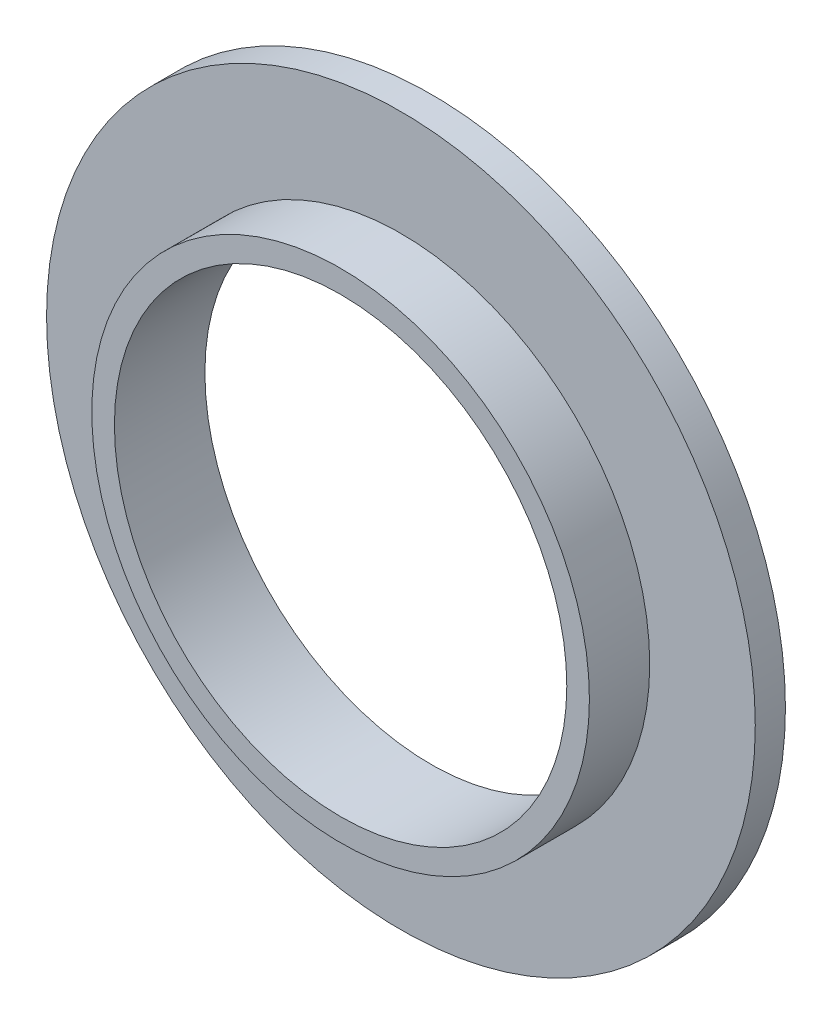
ISO-10303-21;
HEADER;
FILE_DESCRIPTION(('STEP AP214'),'2;1');
FILE_NAME('part.step','',(''),(''),'','','');
FILE_SCHEMA(('AUTOMOTIVE_DESIGN { 1 0 10303 214 1 1 1 1 }'));
ENDSEC;
DATA;
#1=APPLICATION_CONTEXT('core data for automotive mechanical design processes');
#2=APPLICATION_PROTOCOL_DEFINITION('international standard','automotive_design',2000,#1);
#3=PRODUCT_CONTEXT('',#1,'mechanical');
#4=PRODUCT('Part','Part','',(#3));
#5=PRODUCT_RELATED_PRODUCT_CATEGORY('part','',(#4));
#6=PRODUCT_DEFINITION_FORMATION('','',#4);
#7=PRODUCT_DEFINITION_CONTEXT('part definition',#1,'design');
#8=PRODUCT_DEFINITION('design','',#6,#7);
#9=PRODUCT_DEFINITION_SHAPE('','',#8);
#10=(LENGTH_UNIT() NAMED_UNIT(*) SI_UNIT(.MILLI.,.METRE.));
#11=(NAMED_UNIT(*) PLANE_ANGLE_UNIT() SI_UNIT($,.RADIAN.));
#12=(NAMED_UNIT(*) SI_UNIT($,.STERADIAN.) SOLID_ANGLE_UNIT());
#13=UNCERTAINTY_MEASURE_WITH_UNIT(LENGTH_MEASURE(1.E-05),#10,'distance_accuracy_value','');
#14=(GEOMETRIC_REPRESENTATION_CONTEXT(3) GLOBAL_UNCERTAINTY_ASSIGNED_CONTEXT((#13)) GLOBAL_UNIT_ASSIGNED_CONTEXT((#10,
#11,#12)) REPRESENTATION_CONTEXT('',''));
#15=CARTESIAN_POINT('',(0.,0.,0.));
#16=DIRECTION('',(0.,0.,1.));
#17=DIRECTION('',(1.,0.,0.));
#18=AXIS2_PLACEMENT_3D('',#15,#16,#17);
#19=CARTESIAN_POINT('',(0.,0.,2.));
#20=DIRECTION('',(0.,0.,-1.));
#21=DIRECTION('',(-1.,0.,0.));
#22=AXIS2_PLACEMENT_3D('',#19,#20,#21);
#23=CYLINDRICAL_SURFACE('',#22,23.5);
#24=CARTESIAN_POINT('',(0.,0.,2.));
#25=DIRECTION('',(0.,0.,1.));
#26=DIRECTION('',(1.,0.,0.));
#27=AXIS2_PLACEMENT_3D('',#24,#25,#26);
#28=CIRCLE('',#27,23.5);
#29=CARTESIAN_POINT('',(23.5,0.,2.));
#30=VERTEX_POINT('',#29);
#31=EDGE_CURVE('E10',#30,#30,#28,.T.);
#32=ORIENTED_EDGE('',*,*,#31,.F.);
#33=EDGE_LOOP('',(#32));
#34=FACE_BOUND('',#33,.T.);
#35=CARTESIAN_POINT('',(0.,0.,0.));
#36=DIRECTION('',(0.,0.,1.));
#37=DIRECTION('',(1.,0.,0.));
#38=AXIS2_PLACEMENT_3D('',#35,#36,#37);
#39=CIRCLE('',#38,23.5);
#40=CARTESIAN_POINT('',(23.5,0.,0.));
#41=VERTEX_POINT('',#40);
#42=EDGE_CURVE('E40',#41,#41,#39,.T.);
#43=ORIENTED_EDGE('',*,*,#42,.T.);
#44=EDGE_LOOP('',(#43));
#45=FACE_BOUND('',#44,.T.);
#46=ADVANCED_FACE('F37',(#34,#45),#23,.T.);
#47=CARTESIAN_POINT('',(0.,0.,2.));
#48=DIRECTION('',(0.,0.,1.));
#49=DIRECTION('',(1.,0.,0.));
#50=AXIS2_PLACEMENT_3D('',#47,#48,#49);
#51=PLANE('',#50);
#52=CARTESIAN_POINT('',(0.,0.,2.));
#53=DIRECTION('',(0.,0.,1.));
#54=DIRECTION('',(1.,0.,0.));
#55=AXIS2_PLACEMENT_3D('',#52,#53,#54);
#56=CIRCLE('',#55,16.5);
#57=CARTESIAN_POINT('',(16.5,0.,2.));
#58=VERTEX_POINT('',#57);
#59=EDGE_CURVE('E51',#58,#58,#56,.T.);
#60=ORIENTED_EDGE('',*,*,#59,.F.);
#61=EDGE_LOOP('',(#60));
#62=FACE_BOUND('',#61,.T.);
#63=ORIENTED_EDGE('',*,*,#31,.T.);
#64=EDGE_LOOP('',(#63));
#65=FACE_BOUND('',#64,.T.);
#66=ADVANCED_FACE('F74',(#62,#65),#51,.T.);
#67=CARTESIAN_POINT('',(0.,0.,0.));
#68=DIRECTION('',(0.,0.,1.));
#69=DIRECTION('',(1.,0.,0.));
#70=AXIS2_PLACEMENT_3D('',#67,#68,#69);
#71=PLANE('',#70);
#72=CARTESIAN_POINT('',(0.,0.,0.));
#73=DIRECTION('',(0.,0.,-1.));
#74=DIRECTION('',(-1.,0.,0.));
#75=AXIS2_PLACEMENT_3D('',#72,#73,#74);
#76=CIRCLE('',#75,15.);
#77=CARTESIAN_POINT('',(-15.,0.,0.));
#78=VERTEX_POINT('',#77);
#79=EDGE_CURVE('E62',#78,#78,#76,.T.);
#80=ORIENTED_EDGE('',*,*,#79,.F.);
#81=EDGE_LOOP('',(#80));
#82=FACE_BOUND('',#81,.T.);
#83=ORIENTED_EDGE('',*,*,#42,.F.);
#84=EDGE_LOOP('',(#83));
#85=FACE_BOUND('',#84,.T.);
#86=ADVANCED_FACE('F70',(#82,#85),#71,.F.);
#87=CARTESIAN_POINT('',(0.,0.,6.));
#88=DIRECTION('',(0.,0.,1.));
#89=DIRECTION('',(1.,0.,0.));
#90=AXIS2_PLACEMENT_3D('',#87,#88,#89);
#91=PLANE('',#90);
#92=CARTESIAN_POINT('',(0.,0.,6.));
#93=DIRECTION('',(0.,0.,1.));
#94=DIRECTION('',(1.,0.,0.));
#95=AXIS2_PLACEMENT_3D('',#92,#93,#94);
#96=CIRCLE('',#95,16.5);
#97=CARTESIAN_POINT('',(16.5,0.,6.));
#98=VERTEX_POINT('',#97);
#99=EDGE_CURVE('E49',#98,#98,#96,.T.);
#100=ORIENTED_EDGE('',*,*,#99,.T.);
#101=EDGE_LOOP('',(#100));
#102=FACE_BOUND('',#101,.T.);
#103=CARTESIAN_POINT('',(0.,0.,6.));
#104=DIRECTION('',(0.,0.,1.));
#105=DIRECTION('',(1.,0.,0.));
#106=AXIS2_PLACEMENT_3D('',#103,#104,#105);
#107=CIRCLE('',#106,15.);
#108=CARTESIAN_POINT('',(15.,0.,6.));
#109=VERTEX_POINT('',#108);
#110=EDGE_CURVE('E55',#109,#109,#107,.T.);
#111=ORIENTED_EDGE('',*,*,#110,.F.);
#112=EDGE_LOOP('',(#111));
#113=FACE_BOUND('',#112,.T.);
#114=ADVANCED_FACE('F73',(#102,#113),#91,.T.);
#115=CARTESIAN_POINT('',(0.,0.,6.));
#116=DIRECTION('',(0.,0.,-1.));
#117=DIRECTION('',(-1.,0.,0.));
#118=AXIS2_PLACEMENT_3D('',#115,#116,#117);
#119=CYLINDRICAL_SURFACE('',#118,16.5);
#120=ORIENTED_EDGE('',*,*,#99,.F.);
#121=EDGE_LOOP('',(#120));
#122=FACE_BOUND('',#121,.T.);
#123=ORIENTED_EDGE('',*,*,#59,.T.);
#124=EDGE_LOOP('',(#123));
#125=FACE_BOUND('',#124,.T.);
#126=ADVANCED_FACE('F88',(#122,#125),#119,.T.);
#127=CARTESIAN_POINT('',(0.,0.,6.));
#128=DIRECTION('',(0.,0.,-1.));
#129=DIRECTION('',(-1.,0.,0.));
#130=AXIS2_PLACEMENT_3D('',#127,#128,#129);
#131=CYLINDRICAL_SURFACE('',#130,15.);
#132=ORIENTED_EDGE('',*,*,#79,.T.);
#133=EDGE_LOOP('',(#132));
#134=FACE_BOUND('',#133,.T.);
#135=ORIENTED_EDGE('',*,*,#110,.T.);
#136=EDGE_LOOP('',(#135));
#137=FACE_BOUND('',#136,.T.);
#138=ADVANCED_FACE('F67',(#134,#137),#131,.F.);
#139=CLOSED_SHELL('',(#46,#66,#86,#114,#126,#138));
#140=MANIFOLD_SOLID_BREP('B2',#139);
#141=ADVANCED_BREP_SHAPE_REPRESENTATION('',(#18,#140),#14);
#142=SHAPE_DEFINITION_REPRESENTATION(#9,#141);
ENDSEC;
END-ISO-10303-21;
